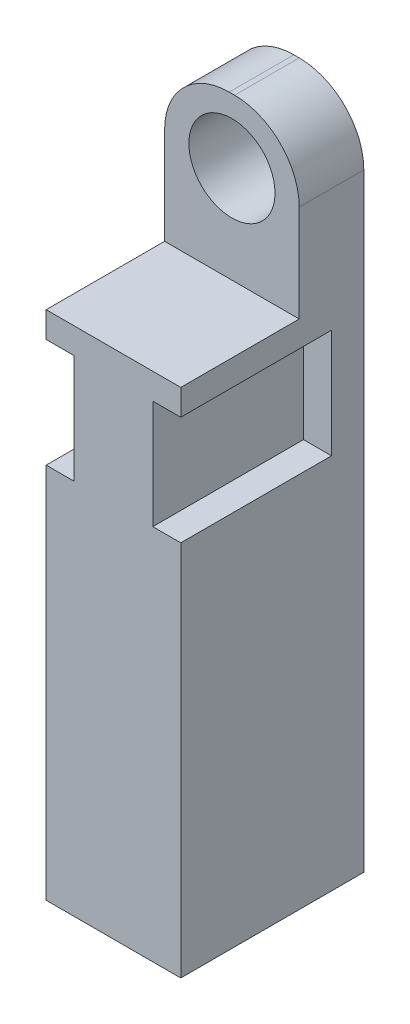
ISO-10303-21;
HEADER;
FILE_DESCRIPTION(('STEP AP214'),'2;1');
FILE_NAME('part.step','',(''),(''),'','','');
FILE_SCHEMA(('AUTOMOTIVE_DESIGN { 1 0 10303 214 1 1 1 1 }'));
ENDSEC;
DATA;
#1=APPLICATION_CONTEXT('core data for automotive mechanical design processes');
#2=APPLICATION_PROTOCOL_DEFINITION('international standard','automotive_design',2000,#1);
#3=PRODUCT_CONTEXT('',#1,'mechanical');
#4=PRODUCT('Part','Part','',(#3));
#5=PRODUCT_RELATED_PRODUCT_CATEGORY('part','',(#4));
#6=PRODUCT_DEFINITION_FORMATION('','',#4);
#7=PRODUCT_DEFINITION_CONTEXT('part definition',#1,'design');
#8=PRODUCT_DEFINITION('design','',#6,#7);
#9=PRODUCT_DEFINITION_SHAPE('','',#8);
#10=(LENGTH_UNIT() NAMED_UNIT(*) SI_UNIT(.MILLI.,.METRE.));
#11=(NAMED_UNIT(*) PLANE_ANGLE_UNIT() SI_UNIT($,.RADIAN.));
#12=(NAMED_UNIT(*) SI_UNIT($,.STERADIAN.) SOLID_ANGLE_UNIT());
#13=UNCERTAINTY_MEASURE_WITH_UNIT(LENGTH_MEASURE(1.E-05),#10,'distance_accuracy_value','');
#14=(GEOMETRIC_REPRESENTATION_CONTEXT(3) GLOBAL_UNCERTAINTY_ASSIGNED_CONTEXT((#13)) GLOBAL_UNIT_ASSIGNED_CONTEXT((#10,
#11,#12)) REPRESENTATION_CONTEXT('',''));
#15=CARTESIAN_POINT('',(0.,0.,0.));
#16=DIRECTION('',(0.,0.,1.));
#17=DIRECTION('',(1.,0.,0.));
#18=AXIS2_PLACEMENT_3D('',#15,#16,#17);
#19=CARTESIAN_POINT('',(-12.5,40.,12.5));
#20=DIRECTION('',(1.,0.,0.));
#21=DIRECTION('',(0.,0.,-1.));
#22=AXIS2_PLACEMENT_3D('',#19,#20,#21);
#23=PLANE('',#22);
#24=DIRECTION('',(0.,0.,1.));
#25=VECTOR('',#24,1.);
#26=CARTESIAN_POINT('',(-12.5,90.2,-15.5));
#27=LINE('',#26,#25);
#28=CARTESIAN_POINT('',(-12.5,90.2,-15.5));
#29=VERTEX_POINT('',#28);
#30=CARTESIAN_POINT('',(-12.5,90.2,12.5));
#31=VERTEX_POINT('',#30);
#32=EDGE_CURVE('E192',#29,#31,#27,.T.);
#33=ORIENTED_EDGE('',*,*,#32,.T.);
#34=DIRECTION('',(0.,-1.,0.));
#35=VECTOR('',#34,1.);
#36=CARTESIAN_POINT('',(-12.5,40.,12.5));
#37=LINE('',#36,#35);
#38=CARTESIAN_POINT('',(-12.5,95.,12.5));
#39=VERTEX_POINT('',#38);
#40=EDGE_CURVE('E309',#39,#31,#37,.T.);
#41=ORIENTED_EDGE('',*,*,#40,.F.);
#42=DIRECTION('',(0.,0.,1.));
#43=VECTOR('',#42,1.);
#44=CARTESIAN_POINT('',(-12.5,95.,-21.5));
#45=LINE('',#44,#43);
#46=CARTESIAN_POINT('',(-12.5,95.,-9.5));
#47=VERTEX_POINT('',#46);
#48=EDGE_CURVE('E250',#47,#39,#45,.T.);
#49=ORIENTED_EDGE('',*,*,#48,.F.);
#50=DIRECTION('',(0.,-1.,0.));
#51=VECTOR('',#50,1.);
#52=CARTESIAN_POINT('',(-12.5,115.,-9.5));
#53=LINE('',#52,#51);
#54=CARTESIAN_POINT('',(-12.5,113.,-9.5));
#55=VERTEX_POINT('',#54);
#56=EDGE_CURVE('E248',#55,#47,#53,.T.);
#57=ORIENTED_EDGE('',*,*,#56,.F.);
#58=DIRECTION('',(0.,0.,1.));
#59=VECTOR('',#58,1.);
#60=CARTESIAN_POINT('',(-12.5,113.,-21.5));
#61=LINE('',#60,#59);
#62=CARTESIAN_POINT('',(-12.5,113.,-21.5));
#63=VERTEX_POINT('',#62);
#64=EDGE_CURVE('E11',#55,#63,#61,.F.);
#65=ORIENTED_EDGE('',*,*,#64,.T.);
#66=DIRECTION('',(0.,-1.,0.));
#67=VECTOR('',#66,1.);
#68=CARTESIAN_POINT('',(-12.5,40.,-21.5));
#69=LINE('',#68,#67);
#70=CARTESIAN_POINT('',(-12.5,0.,-21.5));
#71=VERTEX_POINT('',#70);
#72=EDGE_CURVE('E312',#63,#71,#69,.T.);
#73=ORIENTED_EDGE('',*,*,#72,.T.);
#74=DIRECTION('',(0.,0.,1.));
#75=VECTOR('',#74,1.);
#76=CARTESIAN_POINT('',(-12.5,0.,12.5));
#77=LINE('',#76,#75);
#78=CARTESIAN_POINT('',(-12.5,0.,12.5));
#79=VERTEX_POINT('',#78);
#80=EDGE_CURVE('E298',#71,#79,#77,.T.);
#81=ORIENTED_EDGE('',*,*,#80,.T.);
#82=CARTESIAN_POINT('',(-12.5,70.,12.5));
#83=VERTEX_POINT('',#82);
#84=EDGE_CURVE('E308',#83,#79,#37,.T.);
#85=ORIENTED_EDGE('',*,*,#84,.F.);
#86=DIRECTION('',(0.,0.,1.));
#87=VECTOR('',#86,1.);
#88=CARTESIAN_POINT('',(-12.5,70.,-15.5));
#89=LINE('',#88,#87);
#90=CARTESIAN_POINT('',(-12.5,70.,-15.5));
#91=VERTEX_POINT('',#90);
#92=EDGE_CURVE('E61',#91,#83,#89,.T.);
#93=ORIENTED_EDGE('',*,*,#92,.F.);
#94=DIRECTION('',(0.,-1.,0.));
#95=VECTOR('',#94,1.);
#96=CARTESIAN_POINT('',(-12.5,90.2,-15.5));
#97=LINE('',#96,#95);
#98=EDGE_CURVE('E383',#29,#91,#97,.T.);
#99=ORIENTED_EDGE('',*,*,#98,.F.);
#100=EDGE_LOOP('',(#33,#41,#49,#57,#65,#73,#81,#85,#93,#99));
#101=FACE_BOUND('',#100,.T.);
#102=ADVANCED_FACE('F38',(#101),#23,.F.);
#103=CARTESIAN_POINT('',(-12.5,40.,12.5));
#104=DIRECTION('',(0.,0.,-1.));
#105=DIRECTION('',(-1.,0.,0.));
#106=AXIS2_PLACEMENT_3D('',#103,#104,#105);
#107=PLANE('',#106);
#108=DIRECTION('',(1.,0.,0.));
#109=VECTOR('',#108,1.);
#110=CARTESIAN_POINT('',(-12.5,90.2,12.5));
#111=LINE('',#110,#109);
#112=CARTESIAN_POINT('',(-7.3,90.2,12.5));
#113=VERTEX_POINT('',#112);
#114=EDGE_CURVE('E225',#31,#113,#111,.T.);
#115=ORIENTED_EDGE('',*,*,#114,.T.);
#116=DIRECTION('',(0.,-1.,0.));
#117=VECTOR('',#116,1.);
#118=CARTESIAN_POINT('',(-7.3,90.2,12.5));
#119=LINE('',#118,#117);
#120=CARTESIAN_POINT('',(-7.29999999999999,70.,12.5));
#121=VERTEX_POINT('',#120);
#122=EDGE_CURVE('E197',#113,#121,#119,.T.);
#123=ORIENTED_EDGE('',*,*,#122,.T.);
#124=DIRECTION('',(1.,0.,0.));
#125=VECTOR('',#124,1.);
#126=CARTESIAN_POINT('',(-12.5,70.,12.5));
#127=LINE('',#126,#125);
#128=EDGE_CURVE('E193',#83,#121,#127,.T.);
#129=ORIENTED_EDGE('',*,*,#128,.F.);
#130=ORIENTED_EDGE('',*,*,#84,.T.);
#131=DIRECTION('',(1.,0.,0.));
#132=VECTOR('',#131,1.);
#133=CARTESIAN_POINT('',(-12.5,0.,12.5));
#134=LINE('',#133,#132);
#135=CARTESIAN_POINT('',(12.5,0.,12.5));
#136=VERTEX_POINT('',#135);
#137=EDGE_CURVE('E301',#79,#136,#134,.T.);
#138=ORIENTED_EDGE('',*,*,#137,.T.);
#139=DIRECTION('',(0.,-1.,0.));
#140=VECTOR('',#139,1.);
#141=CARTESIAN_POINT('',(12.5,40.,12.5));
#142=LINE('',#141,#140);
#143=CARTESIAN_POINT('',(12.5,70.,12.5));
#144=VERTEX_POINT('',#143);
#145=EDGE_CURVE('E304',#144,#136,#142,.T.);
#146=ORIENTED_EDGE('',*,*,#145,.F.);
#147=DIRECTION('',(-1.,0.,0.));
#148=VECTOR('',#147,1.);
#149=CARTESIAN_POINT('',(12.5,70.,12.5));
#150=LINE('',#149,#148);
#151=CARTESIAN_POINT('',(7.30000000000001,70.,12.5));
#152=VERTEX_POINT('',#151);
#153=EDGE_CURVE('E217',#144,#152,#150,.T.);
#154=ORIENTED_EDGE('',*,*,#153,.T.);
#155=DIRECTION('',(0.,-1.,0.));
#156=VECTOR('',#155,1.);
#157=CARTESIAN_POINT('',(7.3,90.2,12.5));
#158=LINE('',#157,#156);
#159=CARTESIAN_POINT('',(7.30000000000001,90.2,12.5));
#160=VERTEX_POINT('',#159);
#161=EDGE_CURVE('E220',#160,#152,#158,.T.);
#162=ORIENTED_EDGE('',*,*,#161,.F.);
#163=DIRECTION('',(-1.,0.,0.));
#164=VECTOR('',#163,1.);
#165=CARTESIAN_POINT('',(12.5,90.2,12.5));
#166=LINE('',#165,#164);
#167=CARTESIAN_POINT('',(12.5,90.2,12.5));
#168=VERTEX_POINT('',#167);
#169=EDGE_CURVE('E53',#168,#160,#166,.T.);
#170=ORIENTED_EDGE('',*,*,#169,.F.);
#171=CARTESIAN_POINT('',(12.5,95.,12.5));
#172=VERTEX_POINT('',#171);
#173=EDGE_CURVE('E305',#172,#168,#142,.T.);
#174=ORIENTED_EDGE('',*,*,#173,.F.);
#175=DIRECTION('',(1.,0.,0.));
#176=VECTOR('',#175,1.);
#177=CARTESIAN_POINT('',(-12.5,95.,12.5));
#178=LINE('',#177,#176);
#179=EDGE_CURVE('E252',#39,#172,#178,.T.);
#180=ORIENTED_EDGE('',*,*,#179,.F.);
#181=ORIENTED_EDGE('',*,*,#40,.T.);
#182=EDGE_LOOP('',(#115,#123,#129,#130,#138,#146,#154,#162,#170,#174,#180,#181));
#183=FACE_BOUND('',#182,.T.);
#184=ADVANCED_FACE('F370',(#183),#107,.F.);
#185=CARTESIAN_POINT('',(0.,0.,0.));
#186=DIRECTION('',(0.,-1.,0.));
#187=DIRECTION('',(0.,0.,-1.));
#188=AXIS2_PLACEMENT_3D('',#185,#186,#187);
#189=PLANE('',#188);
#190=DIRECTION('',(0.,0.,-1.));
#191=VECTOR('',#190,1.);
#192=CARTESIAN_POINT('',(12.5,0.,12.5));
#193=LINE('',#192,#191);
#194=CARTESIAN_POINT('',(12.5,0.,-21.5));
#195=VERTEX_POINT('',#194);
#196=EDGE_CURVE('E292',#136,#195,#193,.T.);
#197=ORIENTED_EDGE('',*,*,#196,.F.);
#198=ORIENTED_EDGE('',*,*,#137,.F.);
#199=ORIENTED_EDGE('',*,*,#80,.F.);
#200=DIRECTION('',(-1.,0.,0.));
#201=VECTOR('',#200,1.);
#202=CARTESIAN_POINT('',(-12.5,0.,-21.5));
#203=LINE('',#202,#201);
#204=EDGE_CURVE('E295',#195,#71,#203,.T.);
#205=ORIENTED_EDGE('',*,*,#204,.F.);
#206=EDGE_LOOP('',(#197,#198,#199,#205));
#207=FACE_BOUND('',#206,.T.);
#208=DIRECTION('',(1.,0.,0.));
#209=VECTOR('',#208,1.);
#210=CARTESIAN_POINT('',(-10.25,0.,10.25));
#211=LINE('',#210,#209);
#212=CARTESIAN_POINT('',(-10.25,0.,10.25));
#213=VERTEX_POINT('',#212);
#214=CARTESIAN_POINT('',(10.25,0.,10.25));
#215=VERTEX_POINT('',#214);
#216=EDGE_CURVE('E263',#213,#215,#211,.T.);
#217=ORIENTED_EDGE('',*,*,#216,.T.);
#218=DIRECTION('',(0.,0.,-1.));
#219=VECTOR('',#218,1.);
#220=CARTESIAN_POINT('',(10.25,0.,-10.25));
#221=LINE('',#220,#219);
#222=CARTESIAN_POINT('',(10.25,0.,-10.25));
#223=VERTEX_POINT('',#222);
#224=EDGE_CURVE('E258',#215,#223,#221,.T.);
#225=ORIENTED_EDGE('',*,*,#224,.T.);
#226=DIRECTION('',(-1.,0.,0.));
#227=VECTOR('',#226,1.);
#228=CARTESIAN_POINT('',(-10.25,0.,-10.25));
#229=LINE('',#228,#227);
#230=CARTESIAN_POINT('',(-10.25,0.,-10.25));
#231=VERTEX_POINT('',#230);
#232=EDGE_CURVE('E275',#223,#231,#229,.T.);
#233=ORIENTED_EDGE('',*,*,#232,.T.);
#234=DIRECTION('',(0.,0.,1.));
#235=VECTOR('',#234,1.);
#236=CARTESIAN_POINT('',(-10.25,0.,-10.25));
#237=LINE('',#236,#235);
#238=EDGE_CURVE('E278',#231,#213,#237,.T.);
#239=ORIENTED_EDGE('',*,*,#238,.T.);
#240=EDGE_LOOP('',(#217,#225,#233,#239));
#241=FACE_BOUND('',#240,.T.);
#242=ADVANCED_FACE('F352',(#207,#241),#189,.T.);
#243=CARTESIAN_POINT('',(12.5,40.,12.5));
#244=DIRECTION('',(-1.,0.,0.));
#245=DIRECTION('',(0.,0.,1.));
#246=AXIS2_PLACEMENT_3D('',#243,#244,#245);
#247=PLANE('',#246);
#248=ORIENTED_EDGE('',*,*,#173,.T.);
#249=DIRECTION('',(0.,0.,1.));
#250=VECTOR('',#249,1.);
#251=CARTESIAN_POINT('',(12.5,90.2,-15.5));
#252=LINE('',#251,#250);
#253=CARTESIAN_POINT('',(12.5,90.2,-15.5));
#254=VERTEX_POINT('',#253);
#255=EDGE_CURVE('E215',#254,#168,#252,.T.);
#256=ORIENTED_EDGE('',*,*,#255,.F.);
#257=DIRECTION('',(0.,-1.,0.));
#258=VECTOR('',#257,1.);
#259=CARTESIAN_POINT('',(12.5,90.2,-15.5));
#260=LINE('',#259,#258);
#261=CARTESIAN_POINT('',(12.5,70.,-15.5));
#262=VERTEX_POINT('',#261);
#263=EDGE_CURVE('E209',#254,#262,#260,.T.);
#264=ORIENTED_EDGE('',*,*,#263,.T.);
#265=DIRECTION('',(0.,0.,1.));
#266=VECTOR('',#265,1.);
#267=CARTESIAN_POINT('',(12.5,70.,-15.5));
#268=LINE('',#267,#266);
#269=EDGE_CURVE('E212',#262,#144,#268,.T.);
#270=ORIENTED_EDGE('',*,*,#269,.T.);
#271=ORIENTED_EDGE('',*,*,#145,.T.);
#272=ORIENTED_EDGE('',*,*,#196,.T.);
#273=DIRECTION('',(0.,-1.,0.));
#274=VECTOR('',#273,1.);
#275=CARTESIAN_POINT('',(12.5,40.,-21.5));
#276=LINE('',#275,#274);
#277=CARTESIAN_POINT('',(12.5,113.,-21.5));
#278=VERTEX_POINT('',#277);
#279=EDGE_CURVE('E314',#278,#195,#276,.T.);
#280=ORIENTED_EDGE('',*,*,#279,.F.);
#281=DIRECTION('',(0.,0.,-1.));
#282=VECTOR('',#281,1.);
#283=CARTESIAN_POINT('',(12.5,113.,-9.5));
#284=LINE('',#283,#282);
#285=CARTESIAN_POINT('',(12.5,113.,-9.5));
#286=VERTEX_POINT('',#285);
#287=EDGE_CURVE('E326',#278,#286,#284,.F.);
#288=ORIENTED_EDGE('',*,*,#287,.T.);
#289=DIRECTION('',(0.,-1.,0.));
#290=VECTOR('',#289,1.);
#291=CARTESIAN_POINT('',(12.5,115.,-9.5));
#292=LINE('',#291,#290);
#293=CARTESIAN_POINT('',(12.5,95.,-9.5));
#294=VERTEX_POINT('',#293);
#295=EDGE_CURVE('E246',#286,#294,#292,.T.);
#296=ORIENTED_EDGE('',*,*,#295,.T.);
#297=DIRECTION('',(0.,0.,-1.));
#298=VECTOR('',#297,1.);
#299=CARTESIAN_POINT('',(12.5,95.,-21.5));
#300=LINE('',#299,#298);
#301=EDGE_CURVE('E255',#172,#294,#300,.T.);
#302=ORIENTED_EDGE('',*,*,#301,.F.);
#303=EDGE_LOOP('',(#248,#256,#264,#270,#271,#272,#280,#288,#296,#302));
#304=FACE_BOUND('',#303,.T.);
#305=ADVANCED_FACE('F347',(#304),#247,.F.);
#306=CARTESIAN_POINT('',(-12.5,40.,-21.5));
#307=DIRECTION('',(0.,0.,1.));
#308=DIRECTION('',(1.,0.,0.));
#309=AXIS2_PLACEMENT_3D('',#306,#307,#308);
#310=PLANE('',#309);
#311=CARTESIAN_POINT('',(0.,113.,-21.5));
#312=DIRECTION('',(0.,0.,1.));
#313=DIRECTION('',(1.,0.,0.));
#314=AXIS2_PLACEMENT_3D('',#311,#312,#313);
#315=CIRCLE('',#314,8.);
#316=CARTESIAN_POINT('',(8.,113.,-21.5));
#317=VERTEX_POINT('',#316);
#318=EDGE_CURVE('E202',#317,#317,#315,.T.);
#319=ORIENTED_EDGE('',*,*,#318,.T.);
#320=EDGE_LOOP('',(#319));
#321=FACE_BOUND('',#320,.T.);
#322=DIRECTION('',(-1.,0.,0.));
#323=VECTOR('',#322,1.);
#324=CARTESIAN_POINT('',(-12.5,125.,-21.5));
#325=LINE('',#324,#323);
#326=CARTESIAN_POINT('',(0.500000000000007,125.,-21.5));
#327=VERTEX_POINT('',#326);
#328=CARTESIAN_POINT('',(-0.499999999999997,125.,-21.5));
#329=VERTEX_POINT('',#328);
#330=EDGE_CURVE('E240',#327,#329,#325,.T.);
#331=ORIENTED_EDGE('',*,*,#330,.F.);
#332=CARTESIAN_POINT('',(0.500000000000007,113.,-21.5));
#333=DIRECTION('',(0.,0.,1.));
#334=DIRECTION('',(1.,0.,0.));
#335=AXIS2_PLACEMENT_3D('',#332,#333,#334);
#336=CIRCLE('',#335,12.);
#337=EDGE_CURVE('E324',#327,#278,#336,.F.);
#338=ORIENTED_EDGE('',*,*,#337,.T.);
#339=ORIENTED_EDGE('',*,*,#279,.T.);
#340=ORIENTED_EDGE('',*,*,#204,.T.);
#341=ORIENTED_EDGE('',*,*,#72,.F.);
#342=CARTESIAN_POINT('',(-0.499999999999997,113.,-21.5));
#343=DIRECTION('',(0.,0.,1.));
#344=DIRECTION('',(1.,0.,0.));
#345=AXIS2_PLACEMENT_3D('',#342,#343,#344);
#346=CIRCLE('',#345,12.);
#347=EDGE_CURVE('E322',#63,#329,#346,.F.);
#348=ORIENTED_EDGE('',*,*,#347,.T.);
#349=EDGE_LOOP('',(#331,#338,#339,#340,#341,#348));
#350=FACE_BOUND('',#349,.T.);
#351=ADVANCED_FACE('F344',(#321,#350),#310,.F.);
#352=CARTESIAN_POINT('',(10.25,40.,-10.25));
#353=DIRECTION('',(-1.,0.,0.));
#354=DIRECTION('',(0.,0.,1.));
#355=AXIS2_PLACEMENT_3D('',#352,#353,#354);
#356=PLANE('',#355);
#357=ORIENTED_EDGE('',*,*,#224,.F.);
#358=DIRECTION('',(0.,-1.,0.));
#359=VECTOR('',#358,1.);
#360=CARTESIAN_POINT('',(10.25,40.,10.25));
#361=LINE('',#360,#359);
#362=CARTESIAN_POINT('',(10.25,40.,10.25));
#363=VERTEX_POINT('',#362);
#364=EDGE_CURVE('E272',#363,#215,#361,.T.);
#365=ORIENTED_EDGE('',*,*,#364,.F.);
#366=DIRECTION('',(0.,0.,-1.));
#367=VECTOR('',#366,1.);
#368=CARTESIAN_POINT('',(10.25,40.,-10.25));
#369=LINE('',#368,#367);
#370=CARTESIAN_POINT('',(10.25,40.,-10.25));
#371=VERTEX_POINT('',#370);
#372=EDGE_CURVE('E259',#363,#371,#369,.T.);
#373=ORIENTED_EDGE('',*,*,#372,.T.);
#374=DIRECTION('',(0.,-1.,0.));
#375=VECTOR('',#374,1.);
#376=CARTESIAN_POINT('',(10.25,40.,-10.25));
#377=LINE('',#376,#375);
#378=EDGE_CURVE('E289',#371,#223,#377,.T.);
#379=ORIENTED_EDGE('',*,*,#378,.T.);
#380=EDGE_LOOP('',(#357,#365,#373,#379));
#381=FACE_BOUND('',#380,.T.);
#382=ADVANCED_FACE('F409',(#381),#356,.T.);
#383=CARTESIAN_POINT('',(-10.25,40.,-10.25));
#384=DIRECTION('',(0.,0.,1.));
#385=DIRECTION('',(1.,0.,0.));
#386=AXIS2_PLACEMENT_3D('',#383,#384,#385);
#387=PLANE('',#386);
#388=ORIENTED_EDGE('',*,*,#232,.F.);
#389=ORIENTED_EDGE('',*,*,#378,.F.);
#390=DIRECTION('',(-1.,0.,0.));
#391=VECTOR('',#390,1.);
#392=CARTESIAN_POINT('',(-10.25,40.,-10.25));
#393=LINE('',#392,#391);
#394=CARTESIAN_POINT('',(-10.25,40.,-10.25));
#395=VERTEX_POINT('',#394);
#396=EDGE_CURVE('E262',#371,#395,#393,.T.);
#397=ORIENTED_EDGE('',*,*,#396,.T.);
#398=DIRECTION('',(0.,-1.,0.));
#399=VECTOR('',#398,1.);
#400=CARTESIAN_POINT('',(-10.25,40.,-10.25));
#401=LINE('',#400,#399);
#402=EDGE_CURVE('E287',#395,#231,#401,.T.);
#403=ORIENTED_EDGE('',*,*,#402,.T.);
#404=EDGE_LOOP('',(#388,#389,#397,#403));
#405=FACE_BOUND('',#404,.T.);
#406=ADVANCED_FACE('F445',(#405),#387,.T.);
#407=CARTESIAN_POINT('',(-10.25,40.,-10.25));
#408=DIRECTION('',(1.,0.,0.));
#409=DIRECTION('',(0.,0.,-1.));
#410=AXIS2_PLACEMENT_3D('',#407,#408,#409);
#411=PLANE('',#410);
#412=ORIENTED_EDGE('',*,*,#238,.F.);
#413=ORIENTED_EDGE('',*,*,#402,.F.);
#414=DIRECTION('',(0.,0.,1.));
#415=VECTOR('',#414,1.);
#416=CARTESIAN_POINT('',(-10.25,40.,-10.25));
#417=LINE('',#416,#415);
#418=CARTESIAN_POINT('',(-10.25,40.,10.25));
#419=VERTEX_POINT('',#418);
#420=EDGE_CURVE('E266',#395,#419,#417,.T.);
#421=ORIENTED_EDGE('',*,*,#420,.T.);
#422=DIRECTION('',(0.,-1.,0.));
#423=VECTOR('',#422,1.);
#424=CARTESIAN_POINT('',(-10.25,40.,10.25));
#425=LINE('',#424,#423);
#426=EDGE_CURVE('E285',#419,#213,#425,.T.);
#427=ORIENTED_EDGE('',*,*,#426,.T.);
#428=EDGE_LOOP('',(#412,#413,#421,#427));
#429=FACE_BOUND('',#428,.T.);
#430=ADVANCED_FACE('F441',(#429),#411,.T.);
#431=CARTESIAN_POINT('',(-10.25,40.,10.25));
#432=DIRECTION('',(0.,0.,-1.));
#433=DIRECTION('',(-1.,0.,0.));
#434=AXIS2_PLACEMENT_3D('',#431,#432,#433);
#435=PLANE('',#434);
#436=ORIENTED_EDGE('',*,*,#216,.F.);
#437=ORIENTED_EDGE('',*,*,#426,.F.);
#438=DIRECTION('',(1.,0.,0.));
#439=VECTOR('',#438,1.);
#440=CARTESIAN_POINT('',(-10.25,40.,10.25));
#441=LINE('',#440,#439);
#442=EDGE_CURVE('E269',#419,#363,#441,.T.);
#443=ORIENTED_EDGE('',*,*,#442,.T.);
#444=ORIENTED_EDGE('',*,*,#364,.T.);
#445=EDGE_LOOP('',(#436,#437,#443,#444));
#446=FACE_BOUND('',#445,.T.);
#447=ADVANCED_FACE('F437',(#446),#435,.T.);
#448=CARTESIAN_POINT('',(0.,40.,0.));
#449=DIRECTION('',(0.,1.,0.));
#450=DIRECTION('',(0.,0.,1.));
#451=AXIS2_PLACEMENT_3D('',#448,#449,#450);
#452=PLANE('',#451);
#453=ORIENTED_EDGE('',*,*,#372,.F.);
#454=ORIENTED_EDGE('',*,*,#442,.F.);
#455=ORIENTED_EDGE('',*,*,#420,.F.);
#456=ORIENTED_EDGE('',*,*,#396,.F.);
#457=EDGE_LOOP('',(#453,#454,#455,#456));
#458=FACE_BOUND('',#457,.T.);
#459=ADVANCED_FACE('F434',(#458),#452,.F.);
#460=CARTESIAN_POINT('',(0.,95.,0.));
#461=DIRECTION('',(0.,1.,0.));
#462=DIRECTION('',(0.,0.,1.));
#463=AXIS2_PLACEMENT_3D('',#460,#461,#462);
#464=PLANE('',#463);
#465=DIRECTION('',(1.,0.,0.));
#466=VECTOR('',#465,1.);
#467=CARTESIAN_POINT('',(-12.5,95.,-9.5));
#468=LINE('',#467,#466);
#469=EDGE_CURVE('E243',#47,#294,#468,.T.);
#470=ORIENTED_EDGE('',*,*,#469,.F.);
#471=ORIENTED_EDGE('',*,*,#48,.T.);
#472=ORIENTED_EDGE('',*,*,#179,.T.);
#473=ORIENTED_EDGE('',*,*,#301,.T.);
#474=EDGE_LOOP('',(#470,#471,#472,#473));
#475=FACE_BOUND('',#474,.T.);
#476=ADVANCED_FACE('F366',(#475),#464,.T.);
#477=CARTESIAN_POINT('',(-12.5,115.,-9.5));
#478=DIRECTION('',(0.,0.,-1.));
#479=DIRECTION('',(-1.,0.,0.));
#480=AXIS2_PLACEMENT_3D('',#477,#478,#479);
#481=PLANE('',#480);
#482=CARTESIAN_POINT('',(0.,113.,-9.5));
#483=DIRECTION('',(0.,0.,1.));
#484=DIRECTION('',(1.,0.,0.));
#485=AXIS2_PLACEMENT_3D('',#482,#483,#484);
#486=CIRCLE('',#485,8.);
#487=CARTESIAN_POINT('',(8.,113.,-9.5));
#488=VERTEX_POINT('',#487);
#489=EDGE_CURVE('E198',#488,#488,#486,.T.);
#490=ORIENTED_EDGE('',*,*,#489,.F.);
#491=EDGE_LOOP('',(#490));
#492=FACE_BOUND('',#491,.T.);
#493=ORIENTED_EDGE('',*,*,#295,.F.);
#494=CARTESIAN_POINT('',(0.500000000000006,113.,-9.5));
#495=DIRECTION('',(0.,0.,-1.));
#496=DIRECTION('',(-1.,0.,0.));
#497=AXIS2_PLACEMENT_3D('',#494,#495,#496);
#498=CIRCLE('',#497,12.);
#499=CARTESIAN_POINT('',(0.500000000000006,125.,-9.5));
#500=VERTEX_POINT('',#499);
#501=EDGE_CURVE('E46',#286,#500,#498,.F.);
#502=ORIENTED_EDGE('',*,*,#501,.T.);
#503=DIRECTION('',(1.,0.,0.));
#504=VECTOR('',#503,1.);
#505=CARTESIAN_POINT('',(-12.5,125.,-9.5));
#506=LINE('',#505,#504);
#507=CARTESIAN_POINT('',(-0.499999999999997,125.,-9.5));
#508=VERTEX_POINT('',#507);
#509=EDGE_CURVE('E236',#508,#500,#506,.T.);
#510=ORIENTED_EDGE('',*,*,#509,.F.);
#511=CARTESIAN_POINT('',(-0.499999999999997,113.,-9.5));
#512=DIRECTION('',(0.,0.,-1.));
#513=DIRECTION('',(-1.,0.,0.));
#514=AXIS2_PLACEMENT_3D('',#511,#512,#513);
#515=CIRCLE('',#514,12.);
#516=EDGE_CURVE('E328',#508,#55,#515,.F.);
#517=ORIENTED_EDGE('',*,*,#516,.T.);
#518=ORIENTED_EDGE('',*,*,#56,.T.);
#519=ORIENTED_EDGE('',*,*,#469,.T.);
#520=EDGE_LOOP('',(#493,#502,#510,#517,#518,#519));
#521=FACE_BOUND('',#520,.T.);
#522=ADVANCED_FACE('F333',(#492,#521),#481,.F.);
#523=CARTESIAN_POINT('',(0.,125.,0.));
#524=DIRECTION('',(0.,1.,0.));
#525=DIRECTION('',(0.,0.,1.));
#526=AXIS2_PLACEMENT_3D('',#523,#524,#525);
#527=PLANE('',#526);
#528=ORIENTED_EDGE('',*,*,#509,.T.);
#529=DIRECTION('',(0.,0.,-1.));
#530=VECTOR('',#529,1.);
#531=CARTESIAN_POINT('',(0.500000000000007,125.,-21.5));
#532=LINE('',#531,#530);
#533=EDGE_CURVE('E319',#500,#327,#532,.T.);
#534=ORIENTED_EDGE('',*,*,#533,.T.);
#535=ORIENTED_EDGE('',*,*,#330,.T.);
#536=DIRECTION('',(0.,0.,1.));
#537=VECTOR('',#536,1.);
#538=CARTESIAN_POINT('',(-0.499999999999997,125.,-9.5));
#539=LINE('',#538,#537);
#540=EDGE_CURVE('E316',#329,#508,#539,.T.);
#541=ORIENTED_EDGE('',*,*,#540,.T.);
#542=EDGE_LOOP('',(#528,#534,#535,#541));
#543=FACE_BOUND('',#542,.T.);
#544=ADVANCED_FACE('F338',(#543),#527,.T.);
#545=CARTESIAN_POINT('',(0.,113.,-21.5));
#546=DIRECTION('',(0.,0.,1.));
#547=DIRECTION('',(1.,0.,0.));
#548=AXIS2_PLACEMENT_3D('',#545,#546,#547);
#549=CYLINDRICAL_SURFACE('',#548,8.);
#550=ORIENTED_EDGE('',*,*,#318,.F.);
#551=EDGE_LOOP('',(#550));
#552=FACE_BOUND('',#551,.T.);
#553=ORIENTED_EDGE('',*,*,#489,.T.);
#554=EDGE_LOOP('',(#553));
#555=FACE_BOUND('',#554,.T.);
#556=ADVANCED_FACE('F413',(#552,#555),#549,.F.);
#557=CARTESIAN_POINT('',(0.500000000000005,113.,0.));
#558=DIRECTION('',(0.,0.,1.));
#559=DIRECTION('',(1.,0.,0.));
#560=AXIS2_PLACEMENT_3D('',#557,#558,#559);
#561=CYLINDRICAL_SURFACE('',#560,12.);
#562=ORIENTED_EDGE('',*,*,#501,.F.);
#563=ORIENTED_EDGE('',*,*,#287,.F.);
#564=ORIENTED_EDGE('',*,*,#337,.F.);
#565=ORIENTED_EDGE('',*,*,#533,.F.);
#566=EDGE_LOOP('',(#562,#563,#564,#565));
#567=FACE_BOUND('',#566,.T.);
#568=ADVANCED_FACE('F341',(#567),#561,.T.);
#569=CARTESIAN_POINT('',(-0.499999999999997,113.,0.));
#570=DIRECTION('',(0.,0.,-1.));
#571=DIRECTION('',(-1.,0.,0.));
#572=AXIS2_PLACEMENT_3D('',#569,#570,#571);
#573=CYLINDRICAL_SURFACE('',#572,12.);
#574=ORIENTED_EDGE('',*,*,#347,.F.);
#575=ORIENTED_EDGE('',*,*,#64,.F.);
#576=ORIENTED_EDGE('',*,*,#516,.F.);
#577=ORIENTED_EDGE('',*,*,#540,.F.);
#578=EDGE_LOOP('',(#574,#575,#576,#577));
#579=FACE_BOUND('',#578,.T.);
#580=ADVANCED_FACE('F40',(#579),#573,.T.);
#581=CARTESIAN_POINT('',(12.5,90.2,-15.5));
#582=DIRECTION('',(0.,1.,0.));
#583=DIRECTION('',(0.,0.,1.));
#584=AXIS2_PLACEMENT_3D('',#581,#582,#583);
#585=PLANE('',#584);
#586=ORIENTED_EDGE('',*,*,#169,.T.);
#587=DIRECTION('',(0.,0.,1.));
#588=VECTOR('',#587,1.);
#589=CARTESIAN_POINT('',(7.3,90.2,-15.5));
#590=LINE('',#589,#588);
#591=CARTESIAN_POINT('',(7.3,90.2,-15.5));
#592=VERTEX_POINT('',#591);
#593=EDGE_CURVE('E207',#592,#160,#590,.T.);
#594=ORIENTED_EDGE('',*,*,#593,.F.);
#595=DIRECTION('',(-1.,0.,0.));
#596=VECTOR('',#595,1.);
#597=CARTESIAN_POINT('',(12.5,90.2,-15.5));
#598=LINE('',#597,#596);
#599=EDGE_CURVE('E221',#254,#592,#598,.T.);
#600=ORIENTED_EDGE('',*,*,#599,.F.);
#601=ORIENTED_EDGE('',*,*,#255,.T.);
#602=EDGE_LOOP('',(#586,#594,#600,#601));
#603=FACE_BOUND('',#602,.T.);
#604=ADVANCED_FACE('F377',(#603),#585,.F.);
#605=CARTESIAN_POINT('',(12.5,70.,-15.5));
#606=DIRECTION('',(0.,1.,0.));
#607=DIRECTION('',(0.,0.,1.));
#608=AXIS2_PLACEMENT_3D('',#605,#606,#607);
#609=PLANE('',#608);
#610=ORIENTED_EDGE('',*,*,#153,.F.);
#611=ORIENTED_EDGE('',*,*,#269,.F.);
#612=DIRECTION('',(-1.,0.,0.));
#613=VECTOR('',#612,1.);
#614=CARTESIAN_POINT('',(12.5,70.,-15.5));
#615=LINE('',#614,#613);
#616=CARTESIAN_POINT('',(7.30000000000001,70.,-15.5));
#617=VERTEX_POINT('',#616);
#618=EDGE_CURVE('E228',#262,#617,#615,.T.);
#619=ORIENTED_EDGE('',*,*,#618,.T.);
#620=DIRECTION('',(0.,0.,1.));
#621=VECTOR('',#620,1.);
#622=CARTESIAN_POINT('',(7.30000000000001,70.,-15.5));
#623=LINE('',#622,#621);
#624=EDGE_CURVE('E210',#617,#152,#623,.T.);
#625=ORIENTED_EDGE('',*,*,#624,.T.);
#626=EDGE_LOOP('',(#610,#611,#619,#625));
#627=FACE_BOUND('',#626,.T.);
#628=ADVANCED_FACE('F538',(#627),#609,.T.);
#629=CARTESIAN_POINT('',(7.3,90.2,-15.5));
#630=DIRECTION('',(-1.,0.,0.));
#631=DIRECTION('',(0.,-1.,0.));
#632=AXIS2_PLACEMENT_3D('',#629,#630,#631);
#633=PLANE('',#632);
#634=ORIENTED_EDGE('',*,*,#161,.T.);
#635=ORIENTED_EDGE('',*,*,#624,.F.);
#636=DIRECTION('',(0.,-1.,0.));
#637=VECTOR('',#636,1.);
#638=CARTESIAN_POINT('',(7.3,90.2,-15.5));
#639=LINE('',#638,#637);
#640=EDGE_CURVE('E230',#592,#617,#639,.T.);
#641=ORIENTED_EDGE('',*,*,#640,.F.);
#642=ORIENTED_EDGE('',*,*,#593,.T.);
#643=EDGE_LOOP('',(#634,#635,#641,#642));
#644=FACE_BOUND('',#643,.T.);
#645=ADVANCED_FACE('F374',(#644),#633,.F.);
#646=CARTESIAN_POINT('',(0.,0.,-15.5));
#647=DIRECTION('',(0.,0.,1.));
#648=DIRECTION('',(1.,0.,0.));
#649=AXIS2_PLACEMENT_3D('',#646,#647,#648);
#650=PLANE('',#649);
#651=ORIENTED_EDGE('',*,*,#599,.T.);
#652=ORIENTED_EDGE('',*,*,#640,.T.);
#653=ORIENTED_EDGE('',*,*,#618,.F.);
#654=ORIENTED_EDGE('',*,*,#263,.F.);
#655=EDGE_LOOP('',(#651,#652,#653,#654));
#656=FACE_BOUND('',#655,.T.);
#657=ADVANCED_FACE('F379',(#656),#650,.T.);
#658=CARTESIAN_POINT('',(-12.5,90.2,-15.5));
#659=DIRECTION('',(0.,-1.,0.));
#660=DIRECTION('',(0.,0.,-1.));
#661=AXIS2_PLACEMENT_3D('',#658,#659,#660);
#662=PLANE('',#661);
#663=ORIENTED_EDGE('',*,*,#114,.F.);
#664=ORIENTED_EDGE('',*,*,#32,.F.);
#665=DIRECTION('',(1.,0.,0.));
#666=VECTOR('',#665,1.);
#667=CARTESIAN_POINT('',(-12.5,90.2,-15.5));
#668=LINE('',#667,#666);
#669=CARTESIAN_POINT('',(-7.3,90.2,-15.5));
#670=VERTEX_POINT('',#669);
#671=EDGE_CURVE('E179',#29,#670,#668,.T.);
#672=ORIENTED_EDGE('',*,*,#671,.T.);
#673=DIRECTION('',(0.,0.,1.));
#674=VECTOR('',#673,1.);
#675=CARTESIAN_POINT('',(-7.3,90.2,-15.5));
#676=LINE('',#675,#674);
#677=EDGE_CURVE('E189',#670,#113,#676,.T.);
#678=ORIENTED_EDGE('',*,*,#677,.T.);
#679=EDGE_LOOP('',(#663,#664,#672,#678));
#680=FACE_BOUND('',#679,.T.);
#681=ADVANCED_FACE('F188',(#680),#662,.T.);
#682=CARTESIAN_POINT('',(-7.3,90.2,-15.5));
#683=DIRECTION('',(-1.,0.,0.));
#684=DIRECTION('',(0.,-1.,0.));
#685=AXIS2_PLACEMENT_3D('',#682,#683,#684);
#686=PLANE('',#685);
#687=ORIENTED_EDGE('',*,*,#122,.F.);
#688=ORIENTED_EDGE('',*,*,#677,.F.);
#689=DIRECTION('',(0.,-1.,0.));
#690=VECTOR('',#689,1.);
#691=CARTESIAN_POINT('',(-7.3,90.2,-15.5));
#692=LINE('',#691,#690);
#693=CARTESIAN_POINT('',(-7.29999999999999,70.,-15.5));
#694=VERTEX_POINT('',#693);
#695=EDGE_CURVE('E175',#670,#694,#692,.T.);
#696=ORIENTED_EDGE('',*,*,#695,.T.);
#697=DIRECTION('',(0.,0.,1.));
#698=VECTOR('',#697,1.);
#699=CARTESIAN_POINT('',(-7.29999999999999,70.,-15.5));
#700=LINE('',#699,#698);
#701=EDGE_CURVE('E199',#694,#121,#700,.T.);
#702=ORIENTED_EDGE('',*,*,#701,.T.);
#703=EDGE_LOOP('',(#687,#688,#696,#702));
#704=FACE_BOUND('',#703,.T.);
#705=ADVANCED_FACE('F195',(#704),#686,.T.);
#706=CARTESIAN_POINT('',(-12.5,70.,-15.5));
#707=DIRECTION('',(0.,-1.,0.));
#708=DIRECTION('',(0.,0.,-1.));
#709=AXIS2_PLACEMENT_3D('',#706,#707,#708);
#710=PLANE('',#709);
#711=ORIENTED_EDGE('',*,*,#128,.T.);
#712=ORIENTED_EDGE('',*,*,#701,.F.);
#713=DIRECTION('',(1.,0.,0.));
#714=VECTOR('',#713,1.);
#715=CARTESIAN_POINT('',(-12.5,70.,-15.5));
#716=LINE('',#715,#714);
#717=EDGE_CURVE('E181',#91,#694,#716,.T.);
#718=ORIENTED_EDGE('',*,*,#717,.F.);
#719=ORIENTED_EDGE('',*,*,#92,.T.);
#720=EDGE_LOOP('',(#711,#712,#718,#719));
#721=FACE_BOUND('',#720,.T.);
#722=ADVANCED_FACE('F390',(#721),#710,.F.);
#723=CARTESIAN_POINT('',(0.,0.,-15.5));
#724=DIRECTION('',(0.,0.,-1.));
#725=DIRECTION('',(-1.,0.,0.));
#726=AXIS2_PLACEMENT_3D('',#723,#724,#725);
#727=PLANE('',#726);
#728=ORIENTED_EDGE('',*,*,#671,.F.);
#729=ORIENTED_EDGE('',*,*,#98,.T.);
#730=ORIENTED_EDGE('',*,*,#717,.T.);
#731=ORIENTED_EDGE('',*,*,#695,.F.);
#732=EDGE_LOOP('',(#728,#729,#730,#731));
#733=FACE_BOUND('',#732,.T.);
#734=ADVANCED_FACE('F177',(#733),#727,.F.);
#735=CLOSED_SHELL('',(#102,#184,#242,#305,#351,#382,#406,#430,#447,#459,#476,#522,#544,#556,
#568,#580,#604,#628,#645,#657,#681,#705,#722,#734));
#736=MANIFOLD_SOLID_BREP('B2',#735);
#737=ADVANCED_BREP_SHAPE_REPRESENTATION('',(#18,#736),#14);
#738=SHAPE_DEFINITION_REPRESENTATION(#9,#737);
ENDSEC;
END-ISO-10303-21;
